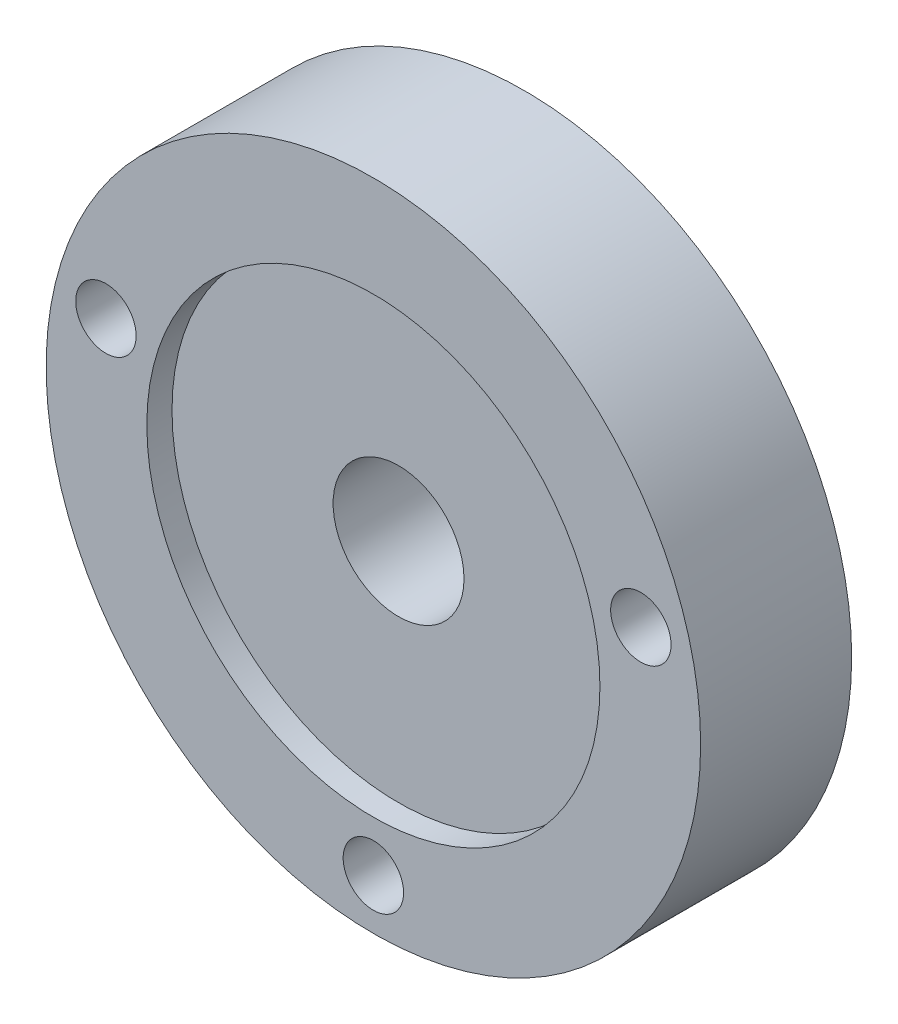
ISO-10303-21;
HEADER;
FILE_DESCRIPTION(('STEP AP214'),'2;1');
FILE_NAME('part.step','',(''),(''),'','','');
FILE_SCHEMA(('AUTOMOTIVE_DESIGN { 1 0 10303 214 1 1 1 1 }'));
ENDSEC;
DATA;
#1=APPLICATION_CONTEXT('core data for automotive mechanical design processes');
#2=APPLICATION_PROTOCOL_DEFINITION('international standard','automotive_design',2000,#1);
#3=PRODUCT_CONTEXT('',#1,'mechanical');
#4=PRODUCT('Part','Part','',(#3));
#5=PRODUCT_RELATED_PRODUCT_CATEGORY('part','',(#4));
#6=PRODUCT_DEFINITION_FORMATION('','',#4);
#7=PRODUCT_DEFINITION_CONTEXT('part definition',#1,'design');
#8=PRODUCT_DEFINITION('design','',#6,#7);
#9=PRODUCT_DEFINITION_SHAPE('','',#8);
#10=(LENGTH_UNIT() NAMED_UNIT(*) SI_UNIT(.MILLI.,.METRE.));
#11=(NAMED_UNIT(*) PLANE_ANGLE_UNIT() SI_UNIT($,.RADIAN.));
#12=(NAMED_UNIT(*) SI_UNIT($,.STERADIAN.) SOLID_ANGLE_UNIT());
#13=UNCERTAINTY_MEASURE_WITH_UNIT(LENGTH_MEASURE(1.E-05),#10,'distance_accuracy_value','');
#14=(GEOMETRIC_REPRESENTATION_CONTEXT(3) GLOBAL_UNCERTAINTY_ASSIGNED_CONTEXT((#13)) GLOBAL_UNIT_ASSIGNED_CONTEXT((#10,
#11,#12)) REPRESENTATION_CONTEXT('',''));
#15=CARTESIAN_POINT('',(0.,0.,0.));
#16=DIRECTION('',(0.,0.,1.));
#17=DIRECTION('',(1.,0.,0.));
#18=AXIS2_PLACEMENT_3D('',#15,#16,#17);
#19=CARTESIAN_POINT('',(0.,0.,15.));
#20=DIRECTION('',(0.,0.,-1.));
#21=DIRECTION('',(-1.,0.,0.));
#22=AXIS2_PLACEMENT_3D('',#19,#20,#21);
#23=CYLINDRICAL_SURFACE('',#22,32.5);
#24=CARTESIAN_POINT('',(0.,0.,15.));
#25=DIRECTION('',(0.,0.,1.));
#26=DIRECTION('',(1.,0.,0.));
#27=AXIS2_PLACEMENT_3D('',#24,#25,#26);
#28=CIRCLE('',#27,32.5);
#29=CARTESIAN_POINT('',(32.5,0.,15.));
#30=VERTEX_POINT('',#29);
#31=EDGE_CURVE('E10',#30,#30,#28,.T.);
#32=ORIENTED_EDGE('',*,*,#31,.F.);
#33=EDGE_LOOP('',(#32));
#34=FACE_BOUND('',#33,.T.);
#35=CARTESIAN_POINT('',(0.,0.,0.));
#36=DIRECTION('',(0.,0.,1.));
#37=DIRECTION('',(1.,0.,0.));
#38=AXIS2_PLACEMENT_3D('',#35,#36,#37);
#39=CIRCLE('',#38,32.5);
#40=CARTESIAN_POINT('',(32.5,0.,0.));
#41=VERTEX_POINT('',#40);
#42=EDGE_CURVE('E35',#41,#41,#39,.T.);
#43=ORIENTED_EDGE('',*,*,#42,.T.);
#44=EDGE_LOOP('',(#43));
#45=FACE_BOUND('',#44,.T.);
#46=ADVANCED_FACE('F32',(#34,#45),#23,.T.);
#47=CARTESIAN_POINT('',(0.,0.,15.));
#48=DIRECTION('',(0.,0.,1.));
#49=DIRECTION('',(1.,0.,0.));
#50=AXIS2_PLACEMENT_3D('',#47,#48,#49);
#51=PLANE('',#50);
#52=CARTESIAN_POINT('',(0.,-27.4999999999999,15.));
#53=DIRECTION('',(0.,0.,1.));
#54=DIRECTION('',(1.,0.,0.));
#55=AXIS2_PLACEMENT_3D('',#52,#53,#54);
#56=CIRCLE('',#55,2.99999999999999);
#57=CARTESIAN_POINT('',(2.99999999999998,-27.4999999999999,15.));
#58=VERTEX_POINT('',#57);
#59=EDGE_CURVE('E70',#58,#58,#56,.T.);
#60=ORIENTED_EDGE('',*,*,#59,.F.);
#61=EDGE_LOOP('',(#60));
#62=FACE_BOUND('',#61,.T.);
#63=CARTESIAN_POINT('',(-26.5629602229489,7.11752374031948,15.));
#64=DIRECTION('',(0.,0.,1.));
#65=DIRECTION('',(1.,0.,0.));
#66=AXIS2_PLACEMENT_3D('',#63,#64,#65);
#67=CIRCLE('',#66,2.99999999999999);
#68=CARTESIAN_POINT('',(-23.5629602229489,7.11752374031948,15.));
#69=VERTEX_POINT('',#68);
#70=EDGE_CURVE('E64',#69,#69,#67,.T.);
#71=ORIENTED_EDGE('',*,*,#70,.F.);
#72=EDGE_LOOP('',(#71));
#73=FACE_BOUND('',#72,.T.);
#74=CARTESIAN_POINT('',(26.5629602229493,7.11752374031948,15.));
#75=DIRECTION('',(0.,0.,1.));
#76=DIRECTION('',(1.,0.,0.));
#77=AXIS2_PLACEMENT_3D('',#74,#75,#76);
#78=CIRCLE('',#77,2.99999999999999);
#79=CARTESIAN_POINT('',(29.5629602229493,7.11752374031948,15.));
#80=VERTEX_POINT('',#79);
#81=EDGE_CURVE('E58',#80,#80,#78,.T.);
#82=ORIENTED_EDGE('',*,*,#81,.F.);
#83=EDGE_LOOP('',(#82));
#84=FACE_BOUND('',#83,.T.);
#85=CARTESIAN_POINT('',(0.,0.,15.));
#86=DIRECTION('',(0.,0.,1.));
#87=DIRECTION('',(1.,0.,0.));
#88=AXIS2_PLACEMENT_3D('',#85,#86,#87);
#89=CIRCLE('',#88,22.5);
#90=CARTESIAN_POINT('',(22.5,0.,15.));
#91=VERTEX_POINT('',#90);
#92=EDGE_CURVE('E44',#91,#91,#89,.T.);
#93=ORIENTED_EDGE('',*,*,#92,.F.);
#94=EDGE_LOOP('',(#93));
#95=FACE_BOUND('',#94,.T.);
#96=ORIENTED_EDGE('',*,*,#31,.T.);
#97=EDGE_LOOP('',(#96));
#98=FACE_BOUND('',#97,.T.);
#99=ADVANCED_FACE('F76',(#62,#73,#84,#95,#98),#51,.T.);
#100=CARTESIAN_POINT('',(0.,0.,0.));
#101=DIRECTION('',(0.,0.,1.));
#102=DIRECTION('',(1.,0.,0.));
#103=AXIS2_PLACEMENT_3D('',#100,#101,#102);
#104=PLANE('',#103);
#105=CARTESIAN_POINT('',(0.,-27.4999999999999,0.));
#106=DIRECTION('',(0.,0.,1.));
#107=DIRECTION('',(1.,0.,0.));
#108=AXIS2_PLACEMENT_3D('',#105,#106,#107);
#109=CIRCLE('',#108,3.);
#110=CARTESIAN_POINT('',(2.99999999999998,-27.4999999999999,0.));
#111=VERTEX_POINT('',#110);
#112=EDGE_CURVE('E67',#111,#111,#109,.T.);
#113=ORIENTED_EDGE('',*,*,#112,.T.);
#114=EDGE_LOOP('',(#113));
#115=FACE_BOUND('',#114,.T.);
#116=CARTESIAN_POINT('',(-26.5629602229489,7.11752374031948,0.));
#117=DIRECTION('',(0.,0.,1.));
#118=DIRECTION('',(1.,0.,0.));
#119=AXIS2_PLACEMENT_3D('',#116,#117,#118);
#120=CIRCLE('',#119,3.);
#121=CARTESIAN_POINT('',(-23.5629602229489,7.11752374031948,0.));
#122=VERTEX_POINT('',#121);
#123=EDGE_CURVE('E61',#122,#122,#120,.T.);
#124=ORIENTED_EDGE('',*,*,#123,.T.);
#125=EDGE_LOOP('',(#124));
#126=FACE_BOUND('',#125,.T.);
#127=CARTESIAN_POINT('',(26.5629602229493,7.11752374031948,0.));
#128=DIRECTION('',(0.,0.,1.));
#129=DIRECTION('',(1.,0.,0.));
#130=AXIS2_PLACEMENT_3D('',#127,#128,#129);
#131=CIRCLE('',#130,3.);
#132=CARTESIAN_POINT('',(29.5629602229493,7.11752374031948,0.));
#133=VERTEX_POINT('',#132);
#134=EDGE_CURVE('E53',#133,#133,#131,.T.);
#135=ORIENTED_EDGE('',*,*,#134,.T.);
#136=EDGE_LOOP('',(#135));
#137=FACE_BOUND('',#136,.T.);
#138=CARTESIAN_POINT('',(0.,0.,0.));
#139=DIRECTION('',(0.,0.,1.));
#140=DIRECTION('',(1.,0.,0.));
#141=AXIS2_PLACEMENT_3D('',#138,#139,#140);
#142=CIRCLE('',#141,6.5);
#143=CARTESIAN_POINT('',(6.5,0.,0.));
#144=VERTEX_POINT('',#143);
#145=EDGE_CURVE('E47',#144,#144,#142,.T.);
#146=ORIENTED_EDGE('',*,*,#145,.T.);
#147=EDGE_LOOP('',(#146));
#148=FACE_BOUND('',#147,.T.);
#149=ORIENTED_EDGE('',*,*,#42,.F.);
#150=EDGE_LOOP('',(#149));
#151=FACE_BOUND('',#150,.T.);
#152=ADVANCED_FACE('F79',(#115,#126,#137,#148,#151),#104,.F.);
#153=CARTESIAN_POINT('',(0.,0.,12.5));
#154=DIRECTION('',(0.,0.,1.));
#155=DIRECTION('',(1.,0.,0.));
#156=AXIS2_PLACEMENT_3D('',#153,#154,#155);
#157=CYLINDRICAL_SURFACE('',#156,22.5);
#158=CARTESIAN_POINT('',(0.,0.,12.5));
#159=DIRECTION('',(0.,0.,1.));
#160=DIRECTION('',(1.,0.,0.));
#161=AXIS2_PLACEMENT_3D('',#158,#159,#160);
#162=CIRCLE('',#161,22.5);
#163=CARTESIAN_POINT('',(22.5,0.,12.5));
#164=VERTEX_POINT('',#163);
#165=EDGE_CURVE('E42',#164,#164,#162,.T.);
#166=ORIENTED_EDGE('',*,*,#165,.F.);
#167=EDGE_LOOP('',(#166));
#168=FACE_BOUND('',#167,.T.);
#169=ORIENTED_EDGE('',*,*,#92,.T.);
#170=EDGE_LOOP('',(#169));
#171=FACE_BOUND('',#170,.T.);
#172=ADVANCED_FACE('F87',(#168,#171),#157,.F.);
#173=CARTESIAN_POINT('',(0.,0.,12.5));
#174=DIRECTION('',(0.,0.,1.));
#175=DIRECTION('',(1.,0.,0.));
#176=AXIS2_PLACEMENT_3D('',#173,#174,#175);
#177=PLANE('',#176);
#178=CARTESIAN_POINT('',(0.,0.,12.5));
#179=DIRECTION('',(0.,0.,1.));
#180=DIRECTION('',(1.,0.,0.));
#181=AXIS2_PLACEMENT_3D('',#178,#179,#180);
#182=CIRCLE('',#181,6.5);
#183=CARTESIAN_POINT('',(6.5,0.,12.5));
#184=VERTEX_POINT('',#183);
#185=EDGE_CURVE('E50',#184,#184,#182,.T.);
#186=ORIENTED_EDGE('',*,*,#185,.F.);
#187=EDGE_LOOP('',(#186));
#188=FACE_BOUND('',#187,.T.);
#189=ORIENTED_EDGE('',*,*,#165,.T.);
#190=EDGE_LOOP('',(#189));
#191=FACE_BOUND('',#190,.T.);
#192=ADVANCED_FACE('F89',(#188,#191),#177,.T.);
#193=CARTESIAN_POINT('',(0.,0.,0.));
#194=DIRECTION('',(0.,0.,1.));
#195=DIRECTION('',(1.,0.,0.));
#196=AXIS2_PLACEMENT_3D('',#193,#194,#195);
#197=CYLINDRICAL_SURFACE('',#196,6.5);
#198=CARTESIAN_POINT('',(6.5,0.,0.));
#199=CARTESIAN_POINT('',(6.5,0.,0.130208333333333));
#200=CARTESIAN_POINT('',(6.5,0.,0.260416666666667));
#201=CARTESIAN_POINT('',(6.5,0.,0.520833333333333));
#202=CARTESIAN_POINT('',(6.5,0.,0.651041666666667));
#203=CARTESIAN_POINT('',(6.5,0.,0.911458333333333));
#204=CARTESIAN_POINT('',(6.5,0.,1.04166666666667));
#205=CARTESIAN_POINT('',(6.5,0.,1.30208333333333));
#206=CARTESIAN_POINT('',(6.5,0.,1.43229166666667));
#207=CARTESIAN_POINT('',(6.5,0.,1.69270833333333));
#208=CARTESIAN_POINT('',(6.5,0.,1.82291666666667));
#209=CARTESIAN_POINT('',(6.5,0.,2.08333333333333));
#210=CARTESIAN_POINT('',(6.5,0.,2.21354166666667));
#211=CARTESIAN_POINT('',(6.5,0.,2.47395833333333));
#212=CARTESIAN_POINT('',(6.5,0.,2.60416666666667));
#213=CARTESIAN_POINT('',(6.5,0.,2.86458333333333));
#214=CARTESIAN_POINT('',(6.5,0.,2.99479166666667));
#215=CARTESIAN_POINT('',(6.5,0.,3.25520833333333));
#216=CARTESIAN_POINT('',(6.5,0.,3.38541666666667));
#217=CARTESIAN_POINT('',(6.5,0.,3.64583333333333));
#218=CARTESIAN_POINT('',(6.5,0.,3.77604166666667));
#219=CARTESIAN_POINT('',(6.5,0.,4.03645833333333));
#220=CARTESIAN_POINT('',(6.5,0.,4.16666666666667));
#221=CARTESIAN_POINT('',(6.5,0.,4.42708333333333));
#222=CARTESIAN_POINT('',(6.5,0.,4.55729166666667));
#223=CARTESIAN_POINT('',(6.5,0.,4.81770833333333));
#224=CARTESIAN_POINT('',(6.5,0.,4.94791666666667));
#225=CARTESIAN_POINT('',(6.5,0.,5.20833333333333));
#226=CARTESIAN_POINT('',(6.5,0.,5.33854166666667));
#227=CARTESIAN_POINT('',(6.5,0.,5.59895833333333));
#228=CARTESIAN_POINT('',(6.5,0.,5.72916666666667));
#229=CARTESIAN_POINT('',(6.5,0.,5.98958333333333));
#230=CARTESIAN_POINT('',(6.5,0.,6.11979166666667));
#231=CARTESIAN_POINT('',(6.5,0.,6.38020833333333));
#232=CARTESIAN_POINT('',(6.5,0.,6.51041666666667));
#233=CARTESIAN_POINT('',(6.5,0.,6.77083333333333));
#234=CARTESIAN_POINT('',(6.5,0.,6.90104166666667));
#235=CARTESIAN_POINT('',(6.5,0.,7.16145833333333));
#236=CARTESIAN_POINT('',(6.5,0.,7.29166666666667));
#237=CARTESIAN_POINT('',(6.5,0.,7.55208333333333));
#238=CARTESIAN_POINT('',(6.5,0.,7.68229166666667));
#239=CARTESIAN_POINT('',(6.5,0.,7.94270833333333));
#240=CARTESIAN_POINT('',(6.5,0.,8.07291666666667));
#241=CARTESIAN_POINT('',(6.5,0.,8.33333333333333));
#242=CARTESIAN_POINT('',(6.5,0.,8.46354166666667));
#243=CARTESIAN_POINT('',(6.5,0.,8.72395833333333));
#244=CARTESIAN_POINT('',(6.5,0.,8.85416666666667));
#245=CARTESIAN_POINT('',(6.5,0.,9.11458333333333));
#246=CARTESIAN_POINT('',(6.5,0.,9.24479166666667));
#247=CARTESIAN_POINT('',(6.5,0.,9.50520833333333));
#248=CARTESIAN_POINT('',(6.5,0.,9.63541666666667));
#249=CARTESIAN_POINT('',(6.5,0.,9.89583333333333));
#250=CARTESIAN_POINT('',(6.5,0.,10.0260416666667));
#251=CARTESIAN_POINT('',(6.5,0.,10.2864583333333));
#252=CARTESIAN_POINT('',(6.5,0.,10.4166666666667));
#253=CARTESIAN_POINT('',(6.5,0.,10.6770833333333));
#254=CARTESIAN_POINT('',(6.5,0.,10.8072916666667));
#255=CARTESIAN_POINT('',(6.5,0.,11.0677083333333));
#256=CARTESIAN_POINT('',(6.5,0.,11.1979166666667));
#257=CARTESIAN_POINT('',(6.5,0.,11.4583333333333));
#258=CARTESIAN_POINT('',(6.5,0.,11.5885416666667));
#259=CARTESIAN_POINT('',(6.5,0.,11.8489583333333));
#260=CARTESIAN_POINT('',(6.5,0.,11.9791666666667));
#261=CARTESIAN_POINT('',(6.5,0.,12.2395833333333));
#262=CARTESIAN_POINT('',(6.5,0.,12.3697916666667));
#263=CARTESIAN_POINT('',(6.5,0.,12.5));
#264=B_SPLINE_CURVE_WITH_KNOTS('',3,(#198,#199,#200,#201,#202,#203,#204,#205,#206,#207,#208,
#209,#210,#211,#212,#213,#214,#215,#216,#217,#218,#219,#220,#221,#222,#223,#224,#225,#226,#227,
#228,#229,#230,#231,#232,#233,#234,#235,#236,#237,#238,#239,#240,#241,#242,#243,#244,#245,#246,
#247,#248,#249,#250,#251,#252,#253,#254,#255,#256,#257,#258,#259,#260,#261,#262,#263),
.UNSPECIFIED.,.F.,.F.,(4,2,2,2,2,2,2,2,2,2,2,2,2,2,2,2,2,2,2,2,2,2,2,2,2,2,2,2,2,2,2,2,4),(0.,
0.390625,0.78125,1.171875,1.5625,1.953125,2.34375,2.734375,3.125,3.515625,3.90625,4.296875,
4.6875,5.078125,5.46875,5.859375,6.25,6.640625,7.03125,7.421875,7.8125,8.203125,8.59375,
8.984375,9.375,9.765625,10.15625,10.546875,10.9375,11.328125,11.71875,12.109375,12.5),.UNSPECIFIED.);
#265=EDGE_CURVE('BSEAM96',#144,#184,#264,.T.);
#266=ORIENTED_EDGE('',*,*,#145,.F.);
#267=ORIENTED_EDGE('',*,*,#185,.T.);
#268=ORIENTED_EDGE('',*,*,#265,.T.);
#269=ORIENTED_EDGE('',*,*,#265,.F.);
#270=EDGE_LOOP('',(#266,#268,#267,#269));
#271=FACE_BOUND('',#270,.T.);
#272=ADVANCED_FACE('F96',(#271),#197,.F.);
#273=CARTESIAN_POINT('',(26.5629602229493,7.11752374031948,15.));
#274=DIRECTION('',(0.,0.,1.));
#275=DIRECTION('',(1.,0.,0.));
#276=AXIS2_PLACEMENT_3D('',#273,#274,#275);
#277=CYLINDRICAL_SURFACE('',#276,2.99999999999999);
#278=ORIENTED_EDGE('',*,*,#134,.F.);
#279=EDGE_LOOP('',(#278));
#280=FACE_BOUND('',#279,.T.);
#281=ORIENTED_EDGE('',*,*,#81,.T.);
#282=EDGE_LOOP('',(#281));
#283=FACE_BOUND('',#282,.T.);
#284=ADVANCED_FACE('F123',(#280,#283),#277,.F.);
#285=CARTESIAN_POINT('',(-26.5629602229489,7.11752374031948,15.));
#286=DIRECTION('',(0.,0.,1.));
#287=DIRECTION('',(1.,0.,0.));
#288=AXIS2_PLACEMENT_3D('',#285,#286,#287);
#289=CYLINDRICAL_SURFACE('',#288,2.99999999999999);
#290=ORIENTED_EDGE('',*,*,#123,.F.);
#291=EDGE_LOOP('',(#290));
#292=FACE_BOUND('',#291,.T.);
#293=ORIENTED_EDGE('',*,*,#70,.T.);
#294=EDGE_LOOP('',(#293));
#295=FACE_BOUND('',#294,.T.);
#296=ADVANCED_FACE('F128',(#292,#295),#289,.F.);
#297=CARTESIAN_POINT('',(0.,-27.4999999999999,15.));
#298=DIRECTION('',(0.,0.,1.));
#299=DIRECTION('',(1.,0.,0.));
#300=AXIS2_PLACEMENT_3D('',#297,#298,#299);
#301=CYLINDRICAL_SURFACE('',#300,2.99999999999999);
#302=ORIENTED_EDGE('',*,*,#112,.F.);
#303=EDGE_LOOP('',(#302));
#304=FACE_BOUND('',#303,.T.);
#305=ORIENTED_EDGE('',*,*,#59,.T.);
#306=EDGE_LOOP('',(#305));
#307=FACE_BOUND('',#306,.T.);
#308=ADVANCED_FACE('F74',(#304,#307),#301,.F.);
#309=CLOSED_SHELL('',(#46,#99,#152,#172,#192,#272,#284,#296,#308));
#310=MANIFOLD_SOLID_BREP('B2',#309);
#311=ADVANCED_BREP_SHAPE_REPRESENTATION('',(#18,#310),#14);
#312=SHAPE_DEFINITION_REPRESENTATION(#9,#311);
ENDSEC;
END-ISO-10303-21;
